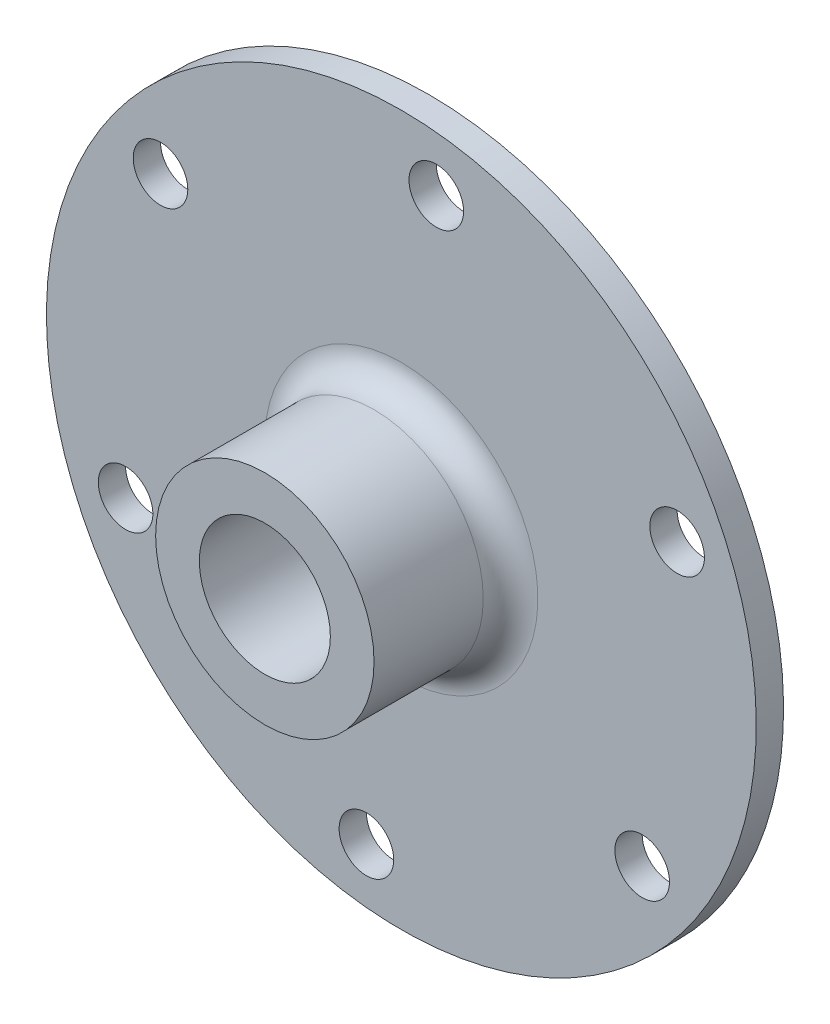
ISO-10303-21;
HEADER;
FILE_DESCRIPTION(('STEP AP214'),'2;1');
FILE_NAME('part.step','',(''),(''),'','','');
FILE_SCHEMA(('AUTOMOTIVE_DESIGN { 1 0 10303 214 1 1 1 1 }'));
ENDSEC;
DATA;
#1=APPLICATION_CONTEXT('core data for automotive mechanical design processes');
#2=APPLICATION_PROTOCOL_DEFINITION('international standard','automotive_design',2000,#1);
#3=PRODUCT_CONTEXT('',#1,'mechanical');
#4=PRODUCT('Part','Part','',(#3));
#5=PRODUCT_RELATED_PRODUCT_CATEGORY('part','',(#4));
#6=PRODUCT_DEFINITION_FORMATION('','',#4);
#7=PRODUCT_DEFINITION_CONTEXT('part definition',#1,'design');
#8=PRODUCT_DEFINITION('design','',#6,#7);
#9=PRODUCT_DEFINITION_SHAPE('','',#8);
#10=(LENGTH_UNIT() NAMED_UNIT(*) SI_UNIT(.MILLI.,.METRE.));
#11=(NAMED_UNIT(*) PLANE_ANGLE_UNIT() SI_UNIT($,.RADIAN.));
#12=(NAMED_UNIT(*) SI_UNIT($,.STERADIAN.) SOLID_ANGLE_UNIT());
#13=UNCERTAINTY_MEASURE_WITH_UNIT(LENGTH_MEASURE(1.E-05),#10,'distance_accuracy_value','');
#14=(GEOMETRIC_REPRESENTATION_CONTEXT(3) GLOBAL_UNCERTAINTY_ASSIGNED_CONTEXT((#13)) GLOBAL_UNIT_ASSIGNED_CONTEXT((#10,
#11,#12)) REPRESENTATION_CONTEXT('',''));
#15=CARTESIAN_POINT('',(0.,0.,0.));
#16=DIRECTION('',(0.,0.,1.));
#17=DIRECTION('',(1.,0.,0.));
#18=AXIS2_PLACEMENT_3D('',#15,#16,#17);
#19=CARTESIAN_POINT('',(0.,0.,19.05));
#20=DIRECTION('',(0.,0.,1.));
#21=DIRECTION('',(0.,-1.,0.));
#22=AXIS2_PLACEMENT_3D('',#19,#20,#21);
#23=PLANE('',#22);
#24=CARTESIAN_POINT('',(0.,0.,19.05));
#25=DIRECTION('',(0.,0.,1.));
#26=DIRECTION('',(1.,0.,0.));
#27=AXIS2_PLACEMENT_3D('',#24,#25,#26);
#28=CIRCLE('',#27,7.62);
#29=CARTESIAN_POINT('',(7.62,0.,19.05));
#30=VERTEX_POINT('',#29);
#31=EDGE_CURVE('E74',#30,#30,#28,.T.);
#32=ORIENTED_EDGE('',*,*,#31,.F.);
#33=EDGE_LOOP('',(#32));
#34=FACE_BOUND('',#33,.T.);
#35=CARTESIAN_POINT('',(0.,0.,19.05));
#36=DIRECTION('',(0.,0.,-1.));
#37=DIRECTION('',(0.,1.,0.));
#38=AXIS2_PLACEMENT_3D('',#35,#36,#37);
#39=CIRCLE('',#38,12.7);
#40=CARTESIAN_POINT('',(0.,12.7,19.05));
#41=VERTEX_POINT('',#40);
#42=EDGE_CURVE('E52',#41,#41,#39,.T.);
#43=ORIENTED_EDGE('',*,*,#42,.F.);
#44=EDGE_LOOP('',(#43));
#45=FACE_BOUND('',#44,.T.);
#46=ADVANCED_FACE('F41',(#34,#45),#23,.T.);
#47=CARTESIAN_POINT('',(0.,0.,0.));
#48=DIRECTION('',(0.,0.,-1.));
#49=DIRECTION('',(0.,1.,0.));
#50=AXIS2_PLACEMENT_3D('',#47,#48,#49);
#51=CYLINDRICAL_SURFACE('',#50,12.7);
#52=CARTESIAN_POINT('',(0.,0.,6.35));
#53=DIRECTION('',(0.,0.,1.));
#54=DIRECTION('',(0.,-1.,0.));
#55=AXIS2_PLACEMENT_3D('',#52,#53,#54);
#56=CIRCLE('',#55,12.7);
#57=CARTESIAN_POINT('',(0.,-12.7,6.34999999999999));
#58=VERTEX_POINT('',#57);
#59=EDGE_CURVE('E10',#58,#58,#56,.T.);
#60=ORIENTED_EDGE('',*,*,#59,.T.);
#61=EDGE_LOOP('',(#60));
#62=FACE_BOUND('',#61,.T.);
#63=ORIENTED_EDGE('',*,*,#42,.T.);
#64=EDGE_LOOP('',(#63));
#65=FACE_BOUND('',#64,.T.);
#66=ADVANCED_FACE('F130',(#62,#65),#51,.T.);
#67=CARTESIAN_POINT('',(0.,12.7,3.175));
#68=DIRECTION('',(0.,0.,1.));
#69=DIRECTION('',(0.,-1.,0.));
#70=AXIS2_PLACEMENT_3D('',#67,#68,#69);
#71=PLANE('',#70);
#72=CARTESIAN_POINT('',(0.,0.,3.175));
#73=DIRECTION('',(0.,0.,1.));
#74=DIRECTION('',(0.,-1.,0.));
#75=AXIS2_PLACEMENT_3D('',#72,#73,#74);
#76=CIRCLE('',#75,15.875);
#77=CARTESIAN_POINT('',(0.,-15.875,3.17499999999999));
#78=VERTEX_POINT('',#77);
#79=EDGE_CURVE('E48',#78,#78,#76,.F.);
#80=ORIENTED_EDGE('',*,*,#79,.T.);
#81=EDGE_LOOP('',(#80));
#82=FACE_BOUND('',#81,.T.);
#83=CARTESIAN_POINT('',(-32.0723720807494,-13.8245641563837,3.175));
#84=DIRECTION('',(0.,0.,1.));
#85=DIRECTION('',(0.,-1.,0.));
#86=AXIS2_PLACEMENT_3D('',#83,#84,#85);
#87=CIRCLE('',#86,3.175);
#88=CARTESIAN_POINT('',(-32.0723720807494,-16.9995641563837,3.17499999999999));
#89=VERTEX_POINT('',#88);
#90=EDGE_CURVE('E75',#89,#89,#87,.T.);
#91=ORIENTED_EDGE('',*,*,#90,.F.);
#92=EDGE_LOOP('',(#91));
#93=FACE_BOUND('',#92,.T.);
#94=CARTESIAN_POINT('',(32.0723720807493,13.8245641563839,3.175));
#95=DIRECTION('',(0.,0.,1.));
#96=DIRECTION('',(0.,-1.,0.));
#97=AXIS2_PLACEMENT_3D('',#94,#95,#96);
#98=CIRCLE('',#97,3.175);
#99=CARTESIAN_POINT('',(32.0723720807493,10.6495641563839,3.175));
#100=VERTEX_POINT('',#99);
#101=EDGE_CURVE('E82',#100,#100,#98,.T.);
#102=ORIENTED_EDGE('',*,*,#101,.F.);
#103=EDGE_LOOP('',(#102));
#104=FACE_BOUND('',#103,.T.);
#105=CARTESIAN_POINT('',(4.06376228469833,34.6877710597476,3.175));
#106=DIRECTION('',(0.,0.,1.));
#107=DIRECTION('',(0.,-1.,0.));
#108=AXIS2_PLACEMENT_3D('',#105,#106,#107);
#109=CIRCLE('',#108,3.175);
#110=CARTESIAN_POINT('',(4.06376228469833,31.5127710597476,3.175));
#111=VERTEX_POINT('',#110);
#112=EDGE_CURVE('E85',#111,#111,#109,.T.);
#113=ORIENTED_EDGE('',*,*,#112,.F.);
#114=EDGE_LOOP('',(#113));
#115=FACE_BOUND('',#114,.T.);
#116=CARTESIAN_POINT('',(-4.06376228469857,-34.6877710597476,3.17499999999999));
#117=DIRECTION('',(0.,0.,1.));
#118=DIRECTION('',(0.,-1.,0.));
#119=AXIS2_PLACEMENT_3D('',#116,#117,#118);
#120=CIRCLE('',#119,3.175);
#121=CARTESIAN_POINT('',(-4.06376228469857,-37.8627710597476,3.17499999999999));
#122=VERTEX_POINT('',#121);
#123=EDGE_CURVE('E88',#122,#122,#120,.T.);
#124=ORIENTED_EDGE('',*,*,#123,.F.);
#125=EDGE_LOOP('',(#124));
#126=FACE_BOUND('',#125,.T.);
#127=CARTESIAN_POINT('',(28.008609796051,-20.8632069033636,3.17499999999999));
#128=DIRECTION('',(0.,0.,1.));
#129=DIRECTION('',(0.,-1.,0.));
#130=AXIS2_PLACEMENT_3D('',#127,#128,#129);
#131=CIRCLE('',#130,3.175);
#132=CARTESIAN_POINT('',(28.008609796051,-24.0382069033636,3.17499999999999));
#133=VERTEX_POINT('',#132);
#134=EDGE_CURVE('E91',#133,#133,#131,.T.);
#135=ORIENTED_EDGE('',*,*,#134,.F.);
#136=EDGE_LOOP('',(#135));
#137=FACE_BOUND('',#136,.T.);
#138=CARTESIAN_POINT('',(-28.008609796051,20.8632069033636,3.175));
#139=DIRECTION('',(0.,0.,1.));
#140=DIRECTION('',(0.,-1.,0.));
#141=AXIS2_PLACEMENT_3D('',#138,#139,#140);
#142=CIRCLE('',#141,3.175);
#143=CARTESIAN_POINT('',(-24.833609796051,20.8632069033636,3.175));
#144=VERTEX_POINT('',#143);
#145=EDGE_CURVE('E67',#144,#144,#142,.T.);
#146=ORIENTED_EDGE('',*,*,#145,.F.);
#147=EDGE_LOOP('',(#146));
#148=FACE_BOUND('',#147,.T.);
#149=CARTESIAN_POINT('',(0.,0.,3.175));
#150=DIRECTION('',(0.,0.,-1.));
#151=DIRECTION('',(0.,1.,0.));
#152=AXIS2_PLACEMENT_3D('',#149,#150,#151);
#153=CIRCLE('',#152,41.275);
#154=CARTESIAN_POINT('',(0.,41.275,3.175));
#155=VERTEX_POINT('',#154);
#156=EDGE_CURVE('E57',#155,#155,#153,.T.);
#157=ORIENTED_EDGE('',*,*,#156,.F.);
#158=EDGE_LOOP('',(#157));
#159=FACE_BOUND('',#158,.T.);
#160=ADVANCED_FACE('F137',(#82,#93,#104,#115,#126,#137,#148,#159),#71,.T.);
#161=CARTESIAN_POINT('',(0.,0.,0.));
#162=DIRECTION('',(0.,0.,-1.));
#163=DIRECTION('',(0.,1.,0.));
#164=AXIS2_PLACEMENT_3D('',#161,#162,#163);
#165=CYLINDRICAL_SURFACE('',#164,41.275);
#166=ORIENTED_EDGE('',*,*,#156,.T.);
#167=EDGE_LOOP('',(#166));
#168=FACE_BOUND('',#167,.T.);
#169=CARTESIAN_POINT('',(0.,0.,0.));
#170=DIRECTION('',(0.,0.,-1.));
#171=DIRECTION('',(0.,1.,0.));
#172=AXIS2_PLACEMENT_3D('',#169,#170,#171);
#173=CIRCLE('',#172,41.275);
#174=CARTESIAN_POINT('',(0.,41.275,0.));
#175=VERTEX_POINT('',#174);
#176=EDGE_CURVE('E63',#175,#175,#173,.T.);
#177=ORIENTED_EDGE('',*,*,#176,.F.);
#178=EDGE_LOOP('',(#177));
#179=FACE_BOUND('',#178,.T.);
#180=ADVANCED_FACE('F144',(#168,#179),#165,.T.);
#181=CARTESIAN_POINT('',(0.,0.,0.));
#182=DIRECTION('',(0.,0.,-1.));
#183=DIRECTION('',(0.,1.,0.));
#184=AXIS2_PLACEMENT_3D('',#181,#182,#183);
#185=PLANE('',#184);
#186=CARTESIAN_POINT('',(-32.0723720807494,-13.8245641563837,0.));
#187=DIRECTION('',(0.,0.,1.));
#188=DIRECTION('',(0.50000000000001,0.866025403784433,0.));
#189=AXIS2_PLACEMENT_3D('',#186,#187,#188);
#190=CIRCLE('',#189,3.175);
#191=CARTESIAN_POINT('',(-30.4848720807493,-11.0749334993681,0.));
#192=VERTEX_POINT('',#191);
#193=EDGE_CURVE('E95',#192,#192,#190,.T.);
#194=ORIENTED_EDGE('',*,*,#193,.T.);
#195=EDGE_LOOP('',(#194));
#196=FACE_BOUND('',#195,.T.);
#197=CARTESIAN_POINT('',(32.0723720807493,13.8245641563839,0.));
#198=DIRECTION('',(0.,0.,1.));
#199=DIRECTION('',(-0.500000000000004,-0.866025403784436,0.));
#200=AXIS2_PLACEMENT_3D('',#197,#198,#199);
#201=CIRCLE('',#200,3.175);
#202=CARTESIAN_POINT('',(30.4848720807493,11.0749334993683,0.));
#203=VERTEX_POINT('',#202);
#204=EDGE_CURVE('E101',#203,#203,#201,.T.);
#205=ORIENTED_EDGE('',*,*,#204,.T.);
#206=EDGE_LOOP('',(#205));
#207=FACE_BOUND('',#206,.T.);
#208=CARTESIAN_POINT('',(4.06376228469833,34.6877710597476,0.));
#209=DIRECTION('',(0.,0.,1.));
#210=DIRECTION('',(0.499999999999998,-0.86602540378444,0.));
#211=AXIS2_PLACEMENT_3D('',#208,#209,#210);
#212=CIRCLE('',#211,3.175);
#213=CARTESIAN_POINT('',(5.65126228469832,31.938140402732,0.));
#214=VERTEX_POINT('',#213);
#215=EDGE_CURVE('E94',#214,#214,#212,.T.);
#216=ORIENTED_EDGE('',*,*,#215,.T.);
#217=EDGE_LOOP('',(#216));
#218=FACE_BOUND('',#217,.T.);
#219=CARTESIAN_POINT('',(-4.06376228469857,-34.6877710597476,0.));
#220=DIRECTION('',(0.,0.,1.));
#221=DIRECTION('',(-0.499999999999992,0.866025403784443,0.));
#222=AXIS2_PLACEMENT_3D('',#219,#220,#221);
#223=CIRCLE('',#222,3.175);
#224=CARTESIAN_POINT('',(-5.65126228469855,-31.938140402732,0.));
#225=VERTEX_POINT('',#224);
#226=EDGE_CURVE('E98',#225,#225,#223,.T.);
#227=ORIENTED_EDGE('',*,*,#226,.T.);
#228=EDGE_LOOP('',(#227));
#229=FACE_BOUND('',#228,.T.);
#230=CARTESIAN_POINT('',(28.008609796051,-20.8632069033636,0.));
#231=DIRECTION('',(0.,0.,1.));
#232=DIRECTION('',(-1.,0.,0.));
#233=AXIS2_PLACEMENT_3D('',#230,#231,#232);
#234=CIRCLE('',#233,3.175);
#235=CARTESIAN_POINT('',(24.833609796051,-20.8632069033636,0.));
#236=VERTEX_POINT('',#235);
#237=EDGE_CURVE('E104',#236,#236,#234,.T.);
#238=ORIENTED_EDGE('',*,*,#237,.T.);
#239=EDGE_LOOP('',(#238));
#240=FACE_BOUND('',#239,.T.);
#241=CARTESIAN_POINT('',(0.,0.,0.));
#242=DIRECTION('',(0.,0.,1.));
#243=DIRECTION('',(1.,0.,0.));
#244=AXIS2_PLACEMENT_3D('',#241,#242,#243);
#245=CIRCLE('',#244,7.62);
#246=CARTESIAN_POINT('',(7.62,0.,0.));
#247=VERTEX_POINT('',#246);
#248=EDGE_CURVE('E70',#247,#247,#245,.T.);
#249=ORIENTED_EDGE('',*,*,#248,.T.);
#250=EDGE_LOOP('',(#249));
#251=FACE_BOUND('',#250,.T.);
#252=CARTESIAN_POINT('',(-28.008609796051,20.8632069033636,0.));
#253=DIRECTION('',(0.,0.,1.));
#254=DIRECTION('',(1.,0.,0.));
#255=AXIS2_PLACEMENT_3D('',#252,#253,#254);
#256=CIRCLE('',#255,3.175);
#257=CARTESIAN_POINT('',(-24.833609796051,20.8632069033636,0.));
#258=VERTEX_POINT('',#257);
#259=EDGE_CURVE('E71',#258,#258,#256,.T.);
#260=ORIENTED_EDGE('',*,*,#259,.T.);
#261=EDGE_LOOP('',(#260));
#262=FACE_BOUND('',#261,.T.);
#263=ORIENTED_EDGE('',*,*,#176,.T.);
#264=EDGE_LOOP('',(#263));
#265=FACE_BOUND('',#264,.T.);
#266=ADVANCED_FACE('F110',(#196,#207,#218,#229,#240,#251,#262,#265),#185,.T.);
#267=CARTESIAN_POINT('',(-28.008609796051,20.8632069033636,0.));
#268=DIRECTION('',(0.,0.,1.));
#269=DIRECTION('',(1.,0.,0.));
#270=AXIS2_PLACEMENT_3D('',#267,#268,#269);
#271=CYLINDRICAL_SURFACE('',#270,3.175);
#272=CARTESIAN_POINT('',(-24.833609796051,20.8632069033636,3.175));
#273=CARTESIAN_POINT('',(-24.833609796051,20.8632069033636,3.14192708333333));
#274=CARTESIAN_POINT('',(-24.833609796051,20.8632069033636,3.10885416666667));
#275=CARTESIAN_POINT('',(-24.833609796051,20.8632069033636,3.04270833333333));
#276=CARTESIAN_POINT('',(-24.833609796051,20.8632069033636,3.00963541666667));
#277=CARTESIAN_POINT('',(-24.833609796051,20.8632069033636,2.94348958333333));
#278=CARTESIAN_POINT('',(-24.833609796051,20.8632069033636,2.91041666666667));
#279=CARTESIAN_POINT('',(-24.833609796051,20.8632069033636,2.84427083333333));
#280=CARTESIAN_POINT('',(-24.833609796051,20.8632069033636,2.81119791666667));
#281=CARTESIAN_POINT('',(-24.833609796051,20.8632069033636,2.74505208333333));
#282=CARTESIAN_POINT('',(-24.833609796051,20.8632069033636,2.71197916666667));
#283=CARTESIAN_POINT('',(-24.833609796051,20.8632069033636,2.64583333333333));
#284=CARTESIAN_POINT('',(-24.833609796051,20.8632069033636,2.61276041666667));
#285=CARTESIAN_POINT('',(-24.833609796051,20.8632069033636,2.54661458333333));
#286=CARTESIAN_POINT('',(-24.833609796051,20.8632069033636,2.51354166666667));
#287=CARTESIAN_POINT('',(-24.833609796051,20.8632069033636,2.44739583333333));
#288=CARTESIAN_POINT('',(-24.833609796051,20.8632069033636,2.41432291666667));
#289=CARTESIAN_POINT('',(-24.833609796051,20.8632069033636,2.34817708333333));
#290=CARTESIAN_POINT('',(-24.833609796051,20.8632069033636,2.31510416666667));
#291=CARTESIAN_POINT('',(-24.833609796051,20.8632069033636,2.24895833333333));
#292=CARTESIAN_POINT('',(-24.833609796051,20.8632069033636,2.21588541666667));
#293=CARTESIAN_POINT('',(-24.833609796051,20.8632069033636,2.14973958333333));
#294=CARTESIAN_POINT('',(-24.833609796051,20.8632069033636,2.11666666666667));
#295=CARTESIAN_POINT('',(-24.833609796051,20.8632069033636,2.05052083333333));
#296=CARTESIAN_POINT('',(-24.833609796051,20.8632069033636,2.01744791666667));
#297=CARTESIAN_POINT('',(-24.833609796051,20.8632069033636,1.95130208333333));
#298=CARTESIAN_POINT('',(-24.833609796051,20.8632069033636,1.91822916666667));
#299=CARTESIAN_POINT('',(-24.833609796051,20.8632069033636,1.85208333333333));
#300=CARTESIAN_POINT('',(-24.833609796051,20.8632069033636,1.81901041666667));
#301=CARTESIAN_POINT('',(-24.833609796051,20.8632069033636,1.75286458333333));
#302=CARTESIAN_POINT('',(-24.833609796051,20.8632069033636,1.71979166666667));
#303=CARTESIAN_POINT('',(-24.833609796051,20.8632069033636,1.65364583333333));
#304=CARTESIAN_POINT('',(-24.833609796051,20.8632069033636,1.62057291666667));
#305=CARTESIAN_POINT('',(-24.833609796051,20.8632069033636,1.55442708333333));
#306=CARTESIAN_POINT('',(-24.833609796051,20.8632069033636,1.52135416666667));
#307=CARTESIAN_POINT('',(-24.833609796051,20.8632069033636,1.45520833333333));
#308=CARTESIAN_POINT('',(-24.833609796051,20.8632069033636,1.42213541666667));
#309=CARTESIAN_POINT('',(-24.833609796051,20.8632069033636,1.35598958333333));
#310=CARTESIAN_POINT('',(-24.833609796051,20.8632069033636,1.32291666666667));
#311=CARTESIAN_POINT('',(-24.833609796051,20.8632069033636,1.25677083333333));
#312=CARTESIAN_POINT('',(-24.833609796051,20.8632069033636,1.22369791666667));
#313=CARTESIAN_POINT('',(-24.833609796051,20.8632069033636,1.15755208333333));
#314=CARTESIAN_POINT('',(-24.833609796051,20.8632069033636,1.12447916666667));
#315=CARTESIAN_POINT('',(-24.833609796051,20.8632069033636,1.05833333333333));
#316=CARTESIAN_POINT('',(-24.833609796051,20.8632069033636,1.02526041666667));
#317=CARTESIAN_POINT('',(-24.833609796051,20.8632069033636,0.959114583333333));
#318=CARTESIAN_POINT('',(-24.833609796051,20.8632069033636,0.926041666666667));
#319=CARTESIAN_POINT('',(-24.833609796051,20.8632069033636,0.859895833333333));
#320=CARTESIAN_POINT('',(-24.833609796051,20.8632069033636,0.826822916666667));
#321=CARTESIAN_POINT('',(-24.833609796051,20.8632069033636,0.760677083333333));
#322=CARTESIAN_POINT('',(-24.833609796051,20.8632069033636,0.727604166666666));
#323=CARTESIAN_POINT('',(-24.833609796051,20.8632069033636,0.661458333333333));
#324=CARTESIAN_POINT('',(-24.833609796051,20.8632069033636,0.628385416666666));
#325=CARTESIAN_POINT('',(-24.833609796051,20.8632069033636,0.562239583333333));
#326=CARTESIAN_POINT('',(-24.833609796051,20.8632069033636,0.529166666666666));
#327=CARTESIAN_POINT('',(-24.833609796051,20.8632069033636,0.463020833333333));
#328=CARTESIAN_POINT('',(-24.833609796051,20.8632069033636,0.429947916666667));
#329=CARTESIAN_POINT('',(-24.833609796051,20.8632069033636,0.363802083333333));
#330=CARTESIAN_POINT('',(-24.833609796051,20.8632069033636,0.330729166666667));
#331=CARTESIAN_POINT('',(-24.833609796051,20.8632069033636,0.264583333333333));
#332=CARTESIAN_POINT('',(-24.833609796051,20.8632069033636,0.231510416666667));
#333=CARTESIAN_POINT('',(-24.833609796051,20.8632069033636,0.165364583333333));
#334=CARTESIAN_POINT('',(-24.833609796051,20.8632069033636,0.132291666666667));
#335=CARTESIAN_POINT('',(-24.833609796051,20.8632069033636,0.0661458333333333));
#336=CARTESIAN_POINT('',(-24.833609796051,20.8632069033636,0.0330729166666666));
#337=CARTESIAN_POINT('',(-24.833609796051,20.8632069033636,0.));
#338=B_SPLINE_CURVE_WITH_KNOTS('',3,(#272,#273,#274,#275,#276,#277,#278,#279,#280,#281,#282,
#283,#284,#285,#286,#287,#288,#289,#290,#291,#292,#293,#294,#295,#296,#297,#298,#299,#300,#301,
#302,#303,#304,#305,#306,#307,#308,#309,#310,#311,#312,#313,#314,#315,#316,#317,#318,#319,#320,
#321,#322,#323,#324,#325,#326,#327,#328,#329,#330,#331,#332,#333,#334,#335,#336,#337),
.UNSPECIFIED.,.F.,.F.,(4,2,2,2,2,2,2,2,2,2,2,2,2,2,2,2,2,2,2,2,2,2,2,2,2,2,2,2,2,2,2,2,4),(0.,
0.0992187499999999,0.1984375,0.29765625,0.396875,0.49609375,0.5953125,0.69453125,0.79375,
0.89296875,0.9921875,1.09140625,1.190625,1.28984375,1.3890625,1.48828125,1.5875,1.68671875,
1.7859375,1.88515625,1.984375,2.08359375,2.1828125,2.28203125,2.38125,2.48046875,2.5796875,
2.67890625,2.778125,2.87734375,2.9765625,3.07578125,3.175),.UNSPECIFIED.);
#339=EDGE_CURVE('BSEAM149',#144,#258,#338,.T.);
#340=ORIENTED_EDGE('',*,*,#145,.T.);
#341=ORIENTED_EDGE('',*,*,#259,.F.);
#342=ORIENTED_EDGE('',*,*,#339,.T.);
#343=ORIENTED_EDGE('',*,*,#339,.F.);
#344=EDGE_LOOP('',(#340,#342,#341,#343));
#345=FACE_BOUND('',#344,.T.);
#346=ADVANCED_FACE('F149',(#345),#271,.F.);
#347=CARTESIAN_POINT('',(0.,0.,0.));
#348=DIRECTION('',(0.,0.,1.));
#349=DIRECTION('',(1.,0.,0.));
#350=AXIS2_PLACEMENT_3D('',#347,#348,#349);
#351=CYLINDRICAL_SURFACE('',#350,7.62);
#352=CARTESIAN_POINT('',(7.62,0.,0.));
#353=CARTESIAN_POINT('',(7.62,0.,0.1984375));
#354=CARTESIAN_POINT('',(7.62,0.,0.396875));
#355=CARTESIAN_POINT('',(7.62,0.,0.79375));
#356=CARTESIAN_POINT('',(7.62,0.,0.9921875));
#357=CARTESIAN_POINT('',(7.62,0.,1.3890625));
#358=CARTESIAN_POINT('',(7.62,0.,1.5875));
#359=CARTESIAN_POINT('',(7.62,0.,1.984375));
#360=CARTESIAN_POINT('',(7.62,0.,2.1828125));
#361=CARTESIAN_POINT('',(7.62,0.,2.5796875));
#362=CARTESIAN_POINT('',(7.62,0.,2.778125));
#363=CARTESIAN_POINT('',(7.62,0.,3.175));
#364=CARTESIAN_POINT('',(7.62,0.,3.3734375));
#365=CARTESIAN_POINT('',(7.62,0.,3.7703125));
#366=CARTESIAN_POINT('',(7.62,0.,3.96875));
#367=CARTESIAN_POINT('',(7.62,0.,4.365625));
#368=CARTESIAN_POINT('',(7.62,0.,4.5640625));
#369=CARTESIAN_POINT('',(7.62,0.,4.9609375));
#370=CARTESIAN_POINT('',(7.62,0.,5.159375));
#371=CARTESIAN_POINT('',(7.62,0.,5.55625));
#372=CARTESIAN_POINT('',(7.62,0.,5.7546875));
#373=CARTESIAN_POINT('',(7.62,0.,6.1515625));
#374=CARTESIAN_POINT('',(7.62,0.,6.35));
#375=CARTESIAN_POINT('',(7.62,0.,6.746875));
#376=CARTESIAN_POINT('',(7.62,0.,6.9453125));
#377=CARTESIAN_POINT('',(7.62,0.,7.3421875));
#378=CARTESIAN_POINT('',(7.62,0.,7.540625));
#379=CARTESIAN_POINT('',(7.62,0.,7.9375));
#380=CARTESIAN_POINT('',(7.62,0.,8.1359375));
#381=CARTESIAN_POINT('',(7.62,0.,8.5328125));
#382=CARTESIAN_POINT('',(7.62,0.,8.73125));
#383=CARTESIAN_POINT('',(7.62,0.,9.128125));
#384=CARTESIAN_POINT('',(7.62,0.,9.3265625));
#385=CARTESIAN_POINT('',(7.62,0.,9.7234375));
#386=CARTESIAN_POINT('',(7.62,0.,9.921875));
#387=CARTESIAN_POINT('',(7.62,0.,10.31875));
#388=CARTESIAN_POINT('',(7.62,0.,10.5171875));
#389=CARTESIAN_POINT('',(7.62,0.,10.9140625));
#390=CARTESIAN_POINT('',(7.62,0.,11.1125));
#391=CARTESIAN_POINT('',(7.62,0.,11.509375));
#392=CARTESIAN_POINT('',(7.62,0.,11.7078125));
#393=CARTESIAN_POINT('',(7.62,0.,12.1046875));
#394=CARTESIAN_POINT('',(7.62,0.,12.303125));
#395=CARTESIAN_POINT('',(7.62,0.,12.7));
#396=CARTESIAN_POINT('',(7.62,0.,12.8984375));
#397=CARTESIAN_POINT('',(7.62,0.,13.2953125));
#398=CARTESIAN_POINT('',(7.62,0.,13.49375));
#399=CARTESIAN_POINT('',(7.62,0.,13.890625));
#400=CARTESIAN_POINT('',(7.62,0.,14.0890625));
#401=CARTESIAN_POINT('',(7.62,0.,14.4859375));
#402=CARTESIAN_POINT('',(7.62,0.,14.684375));
#403=CARTESIAN_POINT('',(7.62,0.,15.08125));
#404=CARTESIAN_POINT('',(7.62,0.,15.2796875));
#405=CARTESIAN_POINT('',(7.62,0.,15.6765625));
#406=CARTESIAN_POINT('',(7.62,0.,15.875));
#407=CARTESIAN_POINT('',(7.62,0.,16.271875));
#408=CARTESIAN_POINT('',(7.62,0.,16.4703125));
#409=CARTESIAN_POINT('',(7.62,0.,16.8671875));
#410=CARTESIAN_POINT('',(7.62,0.,17.065625));
#411=CARTESIAN_POINT('',(7.62,0.,17.4625));
#412=CARTESIAN_POINT('',(7.62,0.,17.6609375));
#413=CARTESIAN_POINT('',(7.62,0.,18.0578125));
#414=CARTESIAN_POINT('',(7.62,0.,18.25625));
#415=CARTESIAN_POINT('',(7.62,0.,18.653125));
#416=CARTESIAN_POINT('',(7.62,0.,18.8515625));
#417=CARTESIAN_POINT('',(7.62,0.,19.05));
#418=B_SPLINE_CURVE_WITH_KNOTS('',3,(#352,#353,#354,#355,#356,#357,#358,#359,#360,#361,#362,
#363,#364,#365,#366,#367,#368,#369,#370,#371,#372,#373,#374,#375,#376,#377,#378,#379,#380,#381,
#382,#383,#384,#385,#386,#387,#388,#389,#390,#391,#392,#393,#394,#395,#396,#397,#398,#399,#400,
#401,#402,#403,#404,#405,#406,#407,#408,#409,#410,#411,#412,#413,#414,#415,#416,#417),
.UNSPECIFIED.,.F.,.F.,(4,2,2,2,2,2,2,2,2,2,2,2,2,2,2,2,2,2,2,2,2,2,2,2,2,2,2,2,2,2,2,2,4),(0.,
0.5953125,1.190625,1.7859375,2.38125,2.9765625,3.571875,4.1671875,4.7625,5.3578125,5.953125,
6.5484375,7.14375,7.7390625,8.334375,8.9296875,9.525,10.1203125,10.715625,11.3109375,11.90625,
12.5015625,13.096875,13.6921875,14.2875,14.8828125,15.478125,16.0734375,16.66875,17.2640625,
17.859375,18.4546875,19.05),.UNSPECIFIED.);
#419=EDGE_CURVE('BSEAM126',#247,#30,#418,.T.);
#420=ORIENTED_EDGE('',*,*,#248,.F.);
#421=ORIENTED_EDGE('',*,*,#31,.T.);
#422=ORIENTED_EDGE('',*,*,#419,.T.);
#423=ORIENTED_EDGE('',*,*,#419,.F.);
#424=EDGE_LOOP('',(#420,#422,#421,#423));
#425=FACE_BOUND('',#424,.T.);
#426=ADVANCED_FACE('F126',(#425),#351,.F.);
#427=CARTESIAN_POINT('',(28.008609796051,-20.8632069033636,0.));
#428=DIRECTION('',(0.,0.,1.));
#429=DIRECTION('',(0.,-1.,0.));
#430=AXIS2_PLACEMENT_3D('',#427,#428,#429);
#431=CYLINDRICAL_SURFACE('',#430,3.175);
#432=ORIENTED_EDGE('',*,*,#134,.T.);
#433=EDGE_LOOP('',(#432));
#434=FACE_BOUND('',#433,.T.);
#435=ORIENTED_EDGE('',*,*,#237,.F.);
#436=EDGE_LOOP('',(#435));
#437=FACE_BOUND('',#436,.T.);
#438=ADVANCED_FACE('F116',(#434,#437),#431,.F.);
#439=CARTESIAN_POINT('',(-4.06376228469857,-34.6877710597476,0.));
#440=DIRECTION('',(0.,0.,1.));
#441=DIRECTION('',(0.,-1.,0.));
#442=AXIS2_PLACEMENT_3D('',#439,#440,#441);
#443=CYLINDRICAL_SURFACE('',#442,3.175);
#444=ORIENTED_EDGE('',*,*,#123,.T.);
#445=EDGE_LOOP('',(#444));
#446=FACE_BOUND('',#445,.T.);
#447=ORIENTED_EDGE('',*,*,#226,.F.);
#448=EDGE_LOOP('',(#447));
#449=FACE_BOUND('',#448,.T.);
#450=ADVANCED_FACE('F113',(#446,#449),#443,.F.);
#451=CARTESIAN_POINT('',(4.06376228469833,34.6877710597476,0.));
#452=DIRECTION('',(0.,0.,1.));
#453=DIRECTION('',(1.,0.,0.));
#454=AXIS2_PLACEMENT_3D('',#451,#452,#453);
#455=CYLINDRICAL_SURFACE('',#454,3.175);
#456=ORIENTED_EDGE('',*,*,#112,.T.);
#457=EDGE_LOOP('',(#456));
#458=FACE_BOUND('',#457,.T.);
#459=ORIENTED_EDGE('',*,*,#215,.F.);
#460=EDGE_LOOP('',(#459));
#461=FACE_BOUND('',#460,.T.);
#462=ADVANCED_FACE('F115',(#458,#461),#455,.F.);
#463=CARTESIAN_POINT('',(32.0723720807493,13.8245641563839,0.));
#464=DIRECTION('',(0.,0.,1.));
#465=DIRECTION('',(0.,-1.,0.));
#466=AXIS2_PLACEMENT_3D('',#463,#464,#465);
#467=CYLINDRICAL_SURFACE('',#466,3.175);
#468=ORIENTED_EDGE('',*,*,#101,.T.);
#469=EDGE_LOOP('',(#468));
#470=FACE_BOUND('',#469,.T.);
#471=ORIENTED_EDGE('',*,*,#204,.F.);
#472=EDGE_LOOP('',(#471));
#473=FACE_BOUND('',#472,.T.);
#474=ADVANCED_FACE('F123',(#470,#473),#467,.F.);
#475=CARTESIAN_POINT('',(-32.0723720807494,-13.8245641563837,0.));
#476=DIRECTION('',(0.,0.,1.));
#477=DIRECTION('',(1.,0.,0.));
#478=AXIS2_PLACEMENT_3D('',#475,#476,#477);
#479=CYLINDRICAL_SURFACE('',#478,3.175);
#480=ORIENTED_EDGE('',*,*,#90,.T.);
#481=EDGE_LOOP('',(#480));
#482=FACE_BOUND('',#481,.T.);
#483=ORIENTED_EDGE('',*,*,#193,.F.);
#484=EDGE_LOOP('',(#483));
#485=FACE_BOUND('',#484,.T.);
#486=ADVANCED_FACE('F156',(#482,#485),#479,.F.);
#487=CARTESIAN_POINT('',(0.,0.,6.35));
#488=DIRECTION('',(0.,0.,1.));
#489=DIRECTION('',(0.,-1.,0.));
#490=AXIS2_PLACEMENT_3D('',#487,#488,#489);
#491=TOROIDAL_SURFACE('',#490,15.875,3.175);
#492=ORIENTED_EDGE('',*,*,#59,.F.);
#493=EDGE_LOOP('',(#492));
#494=FACE_BOUND('',#493,.T.);
#495=ORIENTED_EDGE('',*,*,#79,.F.);
#496=EDGE_LOOP('',(#495));
#497=FACE_BOUND('',#496,.T.);
#498=ADVANCED_FACE('F43',(#494,#497),#491,.F.);
#499=CLOSED_SHELL('',(#46,#66,#160,#180,#266,#346,#426,#438,#450,#462,#474,#486,#498));
#500=MANIFOLD_SOLID_BREP('B2',#499);
#501=ADVANCED_BREP_SHAPE_REPRESENTATION('',(#18,#500),#14);
#502=SHAPE_DEFINITION_REPRESENTATION(#9,#501);
ENDSEC;
END-ISO-10303-21;
